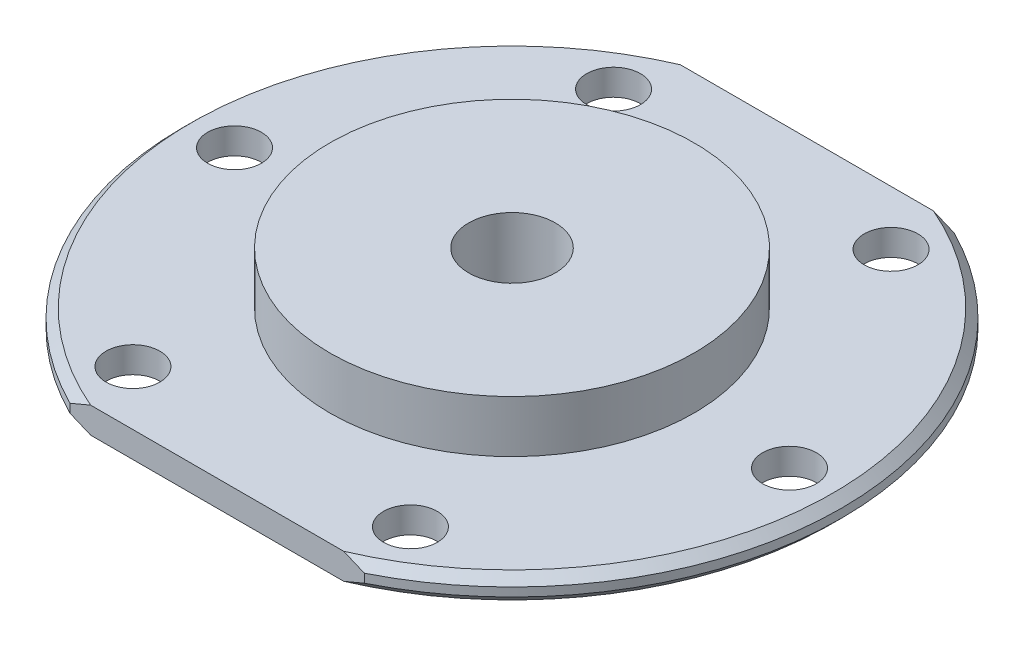
ISO-10303-21;
HEADER;
FILE_DESCRIPTION(('STEP AP214'),'2;1');
FILE_NAME('part.step','',(''),(''),'','','');
FILE_SCHEMA(('AUTOMOTIVE_DESIGN { 1 0 10303 214 1 1 1 1 }'));
ENDSEC;
DATA;
#1=APPLICATION_CONTEXT('core data for automotive mechanical design processes');
#2=APPLICATION_PROTOCOL_DEFINITION('international standard','automotive_design',2000,#1);
#3=PRODUCT_CONTEXT('',#1,'mechanical');
#4=PRODUCT('Part','Part','',(#3));
#5=PRODUCT_RELATED_PRODUCT_CATEGORY('part','',(#4));
#6=PRODUCT_DEFINITION_FORMATION('','',#4);
#7=PRODUCT_DEFINITION_CONTEXT('part definition',#1,'design');
#8=PRODUCT_DEFINITION('design','',#6,#7);
#9=PRODUCT_DEFINITION_SHAPE('','',#8);
#10=(LENGTH_UNIT() NAMED_UNIT(*) SI_UNIT(.MILLI.,.METRE.));
#11=(NAMED_UNIT(*) PLANE_ANGLE_UNIT() SI_UNIT($,.RADIAN.));
#12=(NAMED_UNIT(*) SI_UNIT($,.STERADIAN.) SOLID_ANGLE_UNIT());
#13=UNCERTAINTY_MEASURE_WITH_UNIT(LENGTH_MEASURE(1.E-05),#10,'distance_accuracy_value','');
#14=(GEOMETRIC_REPRESENTATION_CONTEXT(3) GLOBAL_UNCERTAINTY_ASSIGNED_CONTEXT((#13)) GLOBAL_UNIT_ASSIGNED_CONTEXT((#10,
#11,#12)) REPRESENTATION_CONTEXT('',''));
#15=CARTESIAN_POINT('',(0.,0.,0.));
#16=DIRECTION('',(0.,0.,1.));
#17=DIRECTION('',(1.,0.,0.));
#18=AXIS2_PLACEMENT_3D('',#15,#16,#17);
#19=CARTESIAN_POINT('',(0.,1.5,0.));
#20=DIRECTION('',(0.,1.,0.));
#21=DIRECTION('',(0.,0.,1.));
#22=AXIS2_PLACEMENT_3D('',#19,#20,#21);
#23=PLANE('',#22);
#24=CARTESIAN_POINT('',(0.,1.5,0.));
#25=DIRECTION('',(0.,1.,0.));
#26=DIRECTION('',(0.,0.,1.));
#27=AXIS2_PLACEMENT_3D('',#24,#25,#26);
#28=CIRCLE('',#27,10.5);
#29=CARTESIAN_POINT('',(0.,1.5,10.5));
#30=VERTEX_POINT('',#29);
#31=EDGE_CURVE('E124',#30,#30,#28,.T.);
#32=ORIENTED_EDGE('',*,*,#31,.F.);
#33=EDGE_LOOP('',(#32));
#34=FACE_BOUND('',#33,.T.);
#35=CARTESIAN_POINT('',(7.99999999999987,1.5,13.8564064605511));
#36=DIRECTION('',(0.,1.,0.));
#37=DIRECTION('',(0.,0.,1.));
#38=AXIS2_PLACEMENT_3D('',#35,#36,#37);
#39=CIRCLE('',#38,1.55);
#40=CARTESIAN_POINT('',(7.99999999999987,1.5,15.4064064605511));
#41=VERTEX_POINT('',#40);
#42=EDGE_CURVE('E332',#41,#41,#39,.T.);
#43=ORIENTED_EDGE('',*,*,#42,.F.);
#44=EDGE_LOOP('',(#43));
#45=FACE_BOUND('',#44,.T.);
#46=CARTESIAN_POINT('',(8.00000000000007,1.5,-13.856406460551));
#47=DIRECTION('',(0.,1.,0.));
#48=DIRECTION('',(0.,0.,1.));
#49=AXIS2_PLACEMENT_3D('',#46,#47,#48);
#50=CIRCLE('',#49,1.55);
#51=CARTESIAN_POINT('',(8.00000000000007,1.5,-12.306406460551));
#52=VERTEX_POINT('',#51);
#53=EDGE_CURVE('E344',#52,#52,#50,.T.);
#54=ORIENTED_EDGE('',*,*,#53,.F.);
#55=EDGE_LOOP('',(#54));
#56=FACE_BOUND('',#55,.T.);
#57=CARTESIAN_POINT('',(-16.,1.5,0.));
#58=DIRECTION('',(0.,1.,0.));
#59=DIRECTION('',(0.,0.,1.));
#60=AXIS2_PLACEMENT_3D('',#57,#58,#59);
#61=CIRCLE('',#60,1.55);
#62=CARTESIAN_POINT('',(-16.,1.5,1.55));
#63=VERTEX_POINT('',#62);
#64=EDGE_CURVE('E230',#63,#63,#61,.T.);
#65=ORIENTED_EDGE('',*,*,#64,.F.);
#66=EDGE_LOOP('',(#65));
#67=FACE_BOUND('',#66,.T.);
#68=DIRECTION('',(1.,0.,0.));
#69=VECTOR('',#68,1.);
#70=CARTESIAN_POINT('',(-8.48528137423857,1.5,17.));
#71=LINE('',#70,#69);
#72=CARTESIAN_POINT('',(-7.29725975966321,1.5,17.));
#73=VERTEX_POINT('',#72);
#74=CARTESIAN_POINT('',(7.2972597596632,1.5,17.));
#75=VERTEX_POINT('',#74);
#76=EDGE_CURVE('E361',#73,#75,#71,.T.);
#77=ORIENTED_EDGE('',*,*,#76,.T.);
#78=CARTESIAN_POINT('',(0.,1.5,0.));
#79=DIRECTION('',(0.,1.,0.));
#80=DIRECTION('',(0.,0.,1.));
#81=AXIS2_PLACEMENT_3D('',#78,#79,#80);
#82=CIRCLE('',#81,18.5);
#83=CARTESIAN_POINT('',(7.2972597596632,1.5,-17.));
#84=VERTEX_POINT('',#83);
#85=EDGE_CURVE('E235',#75,#84,#82,.T.);
#86=ORIENTED_EDGE('',*,*,#85,.T.);
#87=DIRECTION('',(-1.,0.,0.));
#88=VECTOR('',#87,1.);
#89=CARTESIAN_POINT('',(-8.48528137423856,1.5,-17.));
#90=LINE('',#89,#88);
#91=CARTESIAN_POINT('',(-7.2972597596632,1.5,-17.));
#92=VERTEX_POINT('',#91);
#93=EDGE_CURVE('E108',#84,#92,#90,.T.);
#94=ORIENTED_EDGE('',*,*,#93,.T.);
#95=CARTESIAN_POINT('',(0.,1.5,0.));
#96=DIRECTION('',(0.,1.,0.));
#97=DIRECTION('',(0.,0.,1.));
#98=AXIS2_PLACEMENT_3D('',#95,#96,#97);
#99=CIRCLE('',#98,18.5);
#100=EDGE_CURVE('E233',#92,#73,#99,.T.);
#101=ORIENTED_EDGE('',*,*,#100,.T.);
#102=EDGE_LOOP('',(#77,#86,#94,#101));
#103=FACE_BOUND('',#102,.T.);
#104=CARTESIAN_POINT('',(-7.99999999999997,1.5,-13.856406460551));
#105=DIRECTION('',(0.,1.,0.));
#106=DIRECTION('',(0.,0.,1.));
#107=AXIS2_PLACEMENT_3D('',#104,#105,#106);
#108=CIRCLE('',#107,1.55);
#109=CARTESIAN_POINT('',(-7.99999999999997,1.5,-12.306406460551));
#110=VERTEX_POINT('',#109);
#111=EDGE_CURVE('E350',#110,#110,#108,.T.);
#112=ORIENTED_EDGE('',*,*,#111,.F.);
#113=EDGE_LOOP('',(#112));
#114=FACE_BOUND('',#113,.T.);
#115=CARTESIAN_POINT('',(16.,1.5,1.1172740284298E-13));
#116=DIRECTION('',(0.,1.,0.));
#117=DIRECTION('',(0.,0.,1.));
#118=AXIS2_PLACEMENT_3D('',#115,#116,#117);
#119=CIRCLE('',#118,1.55);
#120=CARTESIAN_POINT('',(16.,1.5,1.55000000000011));
#121=VERTEX_POINT('',#120);
#122=EDGE_CURVE('E338',#121,#121,#119,.T.);
#123=ORIENTED_EDGE('',*,*,#122,.F.);
#124=EDGE_LOOP('',(#123));
#125=FACE_BOUND('',#124,.T.);
#126=CARTESIAN_POINT('',(-8.00000000000016,1.5,13.8564064605509));
#127=DIRECTION('',(0.,1.,0.));
#128=DIRECTION('',(0.,0.,1.));
#129=AXIS2_PLACEMENT_3D('',#126,#127,#128);
#130=CIRCLE('',#129,1.55);
#131=CARTESIAN_POINT('',(-8.00000000000016,1.5,15.4064064605509));
#132=VERTEX_POINT('',#131);
#133=EDGE_CURVE('E326',#132,#132,#130,.T.);
#134=ORIENTED_EDGE('',*,*,#133,.F.);
#135=EDGE_LOOP('',(#134));
#136=FACE_BOUND('',#135,.T.);
#137=ADVANCED_FACE('F35',(#34,#45,#56,#67,#103,#114,#125,#136),#23,.T.);
#138=CARTESIAN_POINT('',(0.,0.,0.));
#139=DIRECTION('',(0.,1.,0.));
#140=DIRECTION('',(0.,0.,1.));
#141=AXIS2_PLACEMENT_3D('',#138,#139,#140);
#142=PLANE('',#141);
#143=CARTESIAN_POINT('',(0.,0.,0.));
#144=DIRECTION('',(0.,-1.,0.));
#145=DIRECTION('',(0.,0.,-1.));
#146=AXIS2_PLACEMENT_3D('',#143,#144,#145);
#147=CIRCLE('',#146,5.);
#148=CARTESIAN_POINT('',(0.,0.,-5.));
#149=VERTEX_POINT('',#148);
#150=EDGE_CURVE('E320',#149,#149,#147,.T.);
#151=ORIENTED_EDGE('',*,*,#150,.F.);
#152=EDGE_LOOP('',(#151));
#153=FACE_BOUND('',#152,.T.);
#154=DIRECTION('',(-1.,0.,0.));
#155=VECTOR('',#154,1.);
#156=CARTESIAN_POINT('',(-8.48528137423856,0.,-17.));
#157=LINE('',#156,#155);
#158=CARTESIAN_POINT('',(7.29725975966319,0.,-17.));
#159=VERTEX_POINT('',#158);
#160=CARTESIAN_POINT('',(-7.29725975966319,0.,-17.));
#161=VERTEX_POINT('',#160);
#162=EDGE_CURVE('E223',#159,#161,#157,.T.);
#163=ORIENTED_EDGE('',*,*,#162,.F.);
#164=CARTESIAN_POINT('',(0.,0.,0.));
#165=DIRECTION('',(0.,1.,0.));
#166=DIRECTION('',(0.,0.,1.));
#167=AXIS2_PLACEMENT_3D('',#164,#165,#166);
#168=CIRCLE('',#167,18.5);
#169=CARTESIAN_POINT('',(7.29725975966319,0.,17.));
#170=VERTEX_POINT('',#169);
#171=EDGE_CURVE('E217',#159,#170,#168,.F.);
#172=ORIENTED_EDGE('',*,*,#171,.T.);
#173=DIRECTION('',(1.,0.,0.));
#174=VECTOR('',#173,1.);
#175=CARTESIAN_POINT('',(-8.48528137423857,0.,17.));
#176=LINE('',#175,#174);
#177=CARTESIAN_POINT('',(-7.29725975966321,0.,17.));
#178=VERTEX_POINT('',#177);
#179=EDGE_CURVE('E229',#178,#170,#176,.T.);
#180=ORIENTED_EDGE('',*,*,#179,.F.);
#181=CARTESIAN_POINT('',(0.,0.,0.));
#182=DIRECTION('',(0.,1.,0.));
#183=DIRECTION('',(0.,0.,1.));
#184=AXIS2_PLACEMENT_3D('',#181,#182,#183);
#185=CIRCLE('',#184,18.5);
#186=EDGE_CURVE('E218',#178,#161,#185,.F.);
#187=ORIENTED_EDGE('',*,*,#186,.T.);
#188=EDGE_LOOP('',(#163,#172,#180,#187));
#189=FACE_BOUND('',#188,.T.);
#190=CARTESIAN_POINT('',(-16.,0.,0.));
#191=DIRECTION('',(0.,1.,0.));
#192=DIRECTION('',(0.,0.,1.));
#193=AXIS2_PLACEMENT_3D('',#190,#191,#192);
#194=CIRCLE('',#193,1.55);
#195=CARTESIAN_POINT('',(-16.,0.,1.55));
#196=VERTEX_POINT('',#195);
#197=EDGE_CURVE('E353',#196,#196,#194,.T.);
#198=ORIENTED_EDGE('',*,*,#197,.T.);
#199=EDGE_LOOP('',(#198));
#200=FACE_BOUND('',#199,.T.);
#201=CARTESIAN_POINT('',(-7.99999999999997,0.,-13.856406460551));
#202=DIRECTION('',(0.,1.,0.));
#203=DIRECTION('',(0.,0.,1.));
#204=AXIS2_PLACEMENT_3D('',#201,#202,#203);
#205=CIRCLE('',#204,1.55);
#206=CARTESIAN_POINT('',(-7.99999999999997,0.,-12.306406460551));
#207=VERTEX_POINT('',#206);
#208=EDGE_CURVE('E347',#207,#207,#205,.T.);
#209=ORIENTED_EDGE('',*,*,#208,.T.);
#210=EDGE_LOOP('',(#209));
#211=FACE_BOUND('',#210,.T.);
#212=CARTESIAN_POINT('',(8.00000000000007,0.,-13.856406460551));
#213=DIRECTION('',(0.,1.,0.));
#214=DIRECTION('',(0.,0.,1.));
#215=AXIS2_PLACEMENT_3D('',#212,#213,#214);
#216=CIRCLE('',#215,1.55);
#217=CARTESIAN_POINT('',(8.00000000000007,0.,-12.306406460551));
#218=VERTEX_POINT('',#217);
#219=EDGE_CURVE('E341',#218,#218,#216,.T.);
#220=ORIENTED_EDGE('',*,*,#219,.T.);
#221=EDGE_LOOP('',(#220));
#222=FACE_BOUND('',#221,.T.);
#223=CARTESIAN_POINT('',(16.,0.,1.1172740284298E-13));
#224=DIRECTION('',(0.,1.,0.));
#225=DIRECTION('',(0.,0.,1.));
#226=AXIS2_PLACEMENT_3D('',#223,#224,#225);
#227=CIRCLE('',#226,1.55);
#228=CARTESIAN_POINT('',(16.,0.,1.55000000000011));
#229=VERTEX_POINT('',#228);
#230=EDGE_CURVE('E335',#229,#229,#227,.T.);
#231=ORIENTED_EDGE('',*,*,#230,.T.);
#232=EDGE_LOOP('',(#231));
#233=FACE_BOUND('',#232,.T.);
#234=CARTESIAN_POINT('',(7.99999999999987,0.,13.8564064605511));
#235=DIRECTION('',(0.,1.,0.));
#236=DIRECTION('',(0.,0.,1.));
#237=AXIS2_PLACEMENT_3D('',#234,#235,#236);
#238=CIRCLE('',#237,1.55);
#239=CARTESIAN_POINT('',(7.99999999999987,0.,15.4064064605511));
#240=VERTEX_POINT('',#239);
#241=EDGE_CURVE('E329',#240,#240,#238,.T.);
#242=ORIENTED_EDGE('',*,*,#241,.T.);
#243=EDGE_LOOP('',(#242));
#244=FACE_BOUND('',#243,.T.);
#245=CARTESIAN_POINT('',(-8.00000000000016,0.,13.8564064605509));
#246=DIRECTION('',(0.,1.,0.));
#247=DIRECTION('',(0.,0.,1.));
#248=AXIS2_PLACEMENT_3D('',#245,#246,#247);
#249=CIRCLE('',#248,1.55);
#250=CARTESIAN_POINT('',(-8.00000000000016,0.,15.4064064605509));
#251=VERTEX_POINT('',#250);
#252=EDGE_CURVE('E317',#251,#251,#249,.T.);
#253=ORIENTED_EDGE('',*,*,#252,.T.);
#254=EDGE_LOOP('',(#253));
#255=FACE_BOUND('',#254,.T.);
#256=ADVANCED_FACE('F207',(#153,#189,#200,#211,#222,#233,#244,#255),#142,.F.);
#257=CARTESIAN_POINT('',(0.,1.5,0.));
#258=DIRECTION('',(0.,-1.,0.));
#259=DIRECTION('',(0.,0.,-1.));
#260=AXIS2_PLACEMENT_3D('',#257,#258,#259);
#261=CYLINDRICAL_SURFACE('',#260,19.);
#262=DIRECTION('',(0.,-1.,0.));
#263=VECTOR('',#262,1.);
#264=CARTESIAN_POINT('',(8.48528137423857,1.5,17.));
#265=LINE('',#264,#263);
#266=CARTESIAN_POINT('',(8.48528137423857,1.,17.));
#267=VERTEX_POINT('',#266);
#268=CARTESIAN_POINT('',(8.48528137423857,0.5,17.));
#269=VERTEX_POINT('',#268);
#270=EDGE_CURVE('E362',#267,#269,#265,.T.);
#271=ORIENTED_EDGE('',*,*,#270,.T.);
#272=CARTESIAN_POINT('',(0.,0.5,0.));
#273=DIRECTION('',(0.,1.,0.));
#274=DIRECTION('',(0.,0.,1.));
#275=AXIS2_PLACEMENT_3D('',#272,#273,#274);
#276=CIRCLE('',#275,19.);
#277=CARTESIAN_POINT('',(8.48528137423856,0.5,-17.));
#278=VERTEX_POINT('',#277);
#279=EDGE_CURVE('E123',#269,#278,#276,.T.);
#280=ORIENTED_EDGE('',*,*,#279,.T.);
#281=DIRECTION('',(0.,-1.,0.));
#282=VECTOR('',#281,1.);
#283=CARTESIAN_POINT('',(8.48528137423856,1.5,-17.));
#284=LINE('',#283,#282);
#285=CARTESIAN_POINT('',(8.48528137423856,1.,-17.));
#286=VERTEX_POINT('',#285);
#287=EDGE_CURVE('E106',#286,#278,#284,.T.);
#288=ORIENTED_EDGE('',*,*,#287,.F.);
#289=CARTESIAN_POINT('',(0.,1.,0.));
#290=DIRECTION('',(0.,1.,0.));
#291=DIRECTION('',(0.,0.,1.));
#292=AXIS2_PLACEMENT_3D('',#289,#290,#291);
#293=CIRCLE('',#292,19.);
#294=EDGE_CURVE('E120',#286,#267,#293,.F.);
#295=ORIENTED_EDGE('',*,*,#294,.T.);
#296=EDGE_LOOP('',(#271,#280,#288,#295));
#297=FACE_BOUND('',#296,.T.);
#298=ADVANCED_FACE('F119',(#297),#261,.T.);
#299=CARTESIAN_POINT('',(-8.48528137423856,1.5,-17.));
#300=DIRECTION('',(0.,0.,1.));
#301=DIRECTION('',(1.,0.,0.));
#302=AXIS2_PLACEMENT_3D('',#299,#300,#301);
#303=PLANE('',#302);
#304=ORIENTED_EDGE('',*,*,#287,.T.);
#305=CARTESIAN_POINT('',(8.48528137423856,0.5,-17.));
#306=CARTESIAN_POINT('',(8.38719130902524,0.456193751763006,-17.));
#307=CARTESIAN_POINT('',(8.28887455002268,0.412894043845016,-17.));
#308=CARTESIAN_POINT('',(8.0917954990056,0.327354382119743,-17.));
#309=CARTESIAN_POINT('',(7.99303326311036,0.285114298994633,-17.));
#310=CARTESIAN_POINT('',(7.79504652511085,0.201729571878801,-17.));
#311=CARTESIAN_POINT('',(7.69582202053382,0.160584933755774,-17.));
#312=CARTESIAN_POINT('',(7.49689622621428,0.0794296704768765,-17.));
#313=CARTESIAN_POINT('',(7.3971948794835,0.039419185034765,-17.));
#314=CARTESIAN_POINT('',(7.2972597596632,0.,-17.));
#315=B_SPLINE_CURVE_WITH_KNOTS('',3,(#305,#306,#307,#308,#309,#310,#311,#312,#313,#314),
.UNSPECIFIED.,.F.,.F.,(4,2,2,2,4),(0.,0.322281422409653,0.644523319969033,0.966766943253074,
1.28905009200689),.UNSPECIFIED.);
#316=EDGE_CURVE('E113',#278,#159,#315,.T.);
#317=ORIENTED_EDGE('',*,*,#316,.T.);
#318=ORIENTED_EDGE('',*,*,#162,.T.);
#319=CARTESIAN_POINT('',(-7.29725975966319,0.,-17.));
#320=CARTESIAN_POINT('',(-7.39719487948349,0.0394191850347754,-17.));
#321=CARTESIAN_POINT('',(-7.49689622621428,0.0794296704768808,-17.));
#322=CARTESIAN_POINT('',(-7.69582202053382,0.160584933755773,-17.));
#323=CARTESIAN_POINT('',(-7.79504652511085,0.201729571878801,-17.));
#324=CARTESIAN_POINT('',(-7.99303326311035,0.285114298994633,-17.));
#325=CARTESIAN_POINT('',(-8.0917954990056,0.327354382119744,-17.));
#326=CARTESIAN_POINT('',(-8.28887455002268,0.412894043845014,-17.));
#327=CARTESIAN_POINT('',(-8.38719130902524,0.456193751763,-17.));
#328=CARTESIAN_POINT('',(-8.48528137423856,0.499999999999986,-17.));
#329=B_SPLINE_CURVE_WITH_KNOTS('',3,(#319,#320,#321,#322,#323,#324,#325,#326,#327,#328),
.UNSPECIFIED.,.F.,.F.,(4,2,2,2,4),(0.,0.322283148753815,0.644526772037856,0.966768669597235,
1.28905009200689),.UNSPECIFIED.);
#330=CARTESIAN_POINT('',(-8.48528137423856,0.5,-17.));
#331=VERTEX_POINT('',#330);
#332=EDGE_CURVE('E114',#161,#331,#329,.T.);
#333=ORIENTED_EDGE('',*,*,#332,.T.);
#334=DIRECTION('',(0.,-1.,0.));
#335=VECTOR('',#334,1.);
#336=CARTESIAN_POINT('',(-8.48528137423856,1.5,-17.));
#337=LINE('',#336,#335);
#338=CARTESIAN_POINT('',(-8.48528137423856,1.,-17.));
#339=VERTEX_POINT('',#338);
#340=EDGE_CURVE('E125',#339,#331,#337,.T.);
#341=ORIENTED_EDGE('',*,*,#340,.F.);
#342=CARTESIAN_POINT('',(-8.48528137423856,1.,-17.));
#343=CARTESIAN_POINT('',(-8.38719130902524,1.043806248237,-17.));
#344=CARTESIAN_POINT('',(-8.28887455002269,1.08710595615498,-17.));
#345=CARTESIAN_POINT('',(-8.0917954990056,1.17264561788026,-17.));
#346=CARTESIAN_POINT('',(-7.99303326311036,1.21488570100537,-17.));
#347=CARTESIAN_POINT('',(-7.79504652511086,1.2982704281212,-17.));
#348=CARTESIAN_POINT('',(-7.69582202053382,1.33941506624422,-17.));
#349=CARTESIAN_POINT('',(-7.49689622621428,1.42057032952312,-17.));
#350=CARTESIAN_POINT('',(-7.39719487948351,1.46058081496524,-17.));
#351=CARTESIAN_POINT('',(-7.29725975966321,1.50000000000003,-17.));
#352=B_SPLINE_CURVE_WITH_KNOTS('',3,(#342,#343,#344,#345,#346,#347,#348,#349,#350,#351),
.UNSPECIFIED.,.F.,.F.,(4,2,2,2,4),(0.,0.32228142240965,0.644523319969028,0.966766943253069,
1.28905009200688),.UNSPECIFIED.);
#353=EDGE_CURVE('E132',#339,#92,#352,.T.);
#354=ORIENTED_EDGE('',*,*,#353,.T.);
#355=ORIENTED_EDGE('',*,*,#93,.F.);
#356=CARTESIAN_POINT('',(7.2972597596632,1.5,-17.));
#357=CARTESIAN_POINT('',(7.3971948794835,1.46058081496522,-17.));
#358=CARTESIAN_POINT('',(7.49689622621428,1.42057032952312,-17.));
#359=CARTESIAN_POINT('',(7.69582202053382,1.33941506624423,-17.));
#360=CARTESIAN_POINT('',(7.79504652511086,1.2982704281212,-17.));
#361=CARTESIAN_POINT('',(7.99303326311036,1.21488570100537,-17.));
#362=CARTESIAN_POINT('',(8.0917954990056,1.17264561788026,-17.));
#363=CARTESIAN_POINT('',(8.28887455002268,1.08710595615498,-17.));
#364=CARTESIAN_POINT('',(8.38719130902524,1.043806248237,-17.));
#365=CARTESIAN_POINT('',(8.48528137423856,1.00000000000001,-17.));
#366=B_SPLINE_CURVE_WITH_KNOTS('',3,(#356,#357,#358,#359,#360,#361,#362,#363,#364,#365),
.UNSPECIFIED.,.F.,.F.,(4,2,2,2,4),(0.,0.322283148753814,0.644526772037853,0.966768669597231,
1.28905009200688),.UNSPECIFIED.);
#367=EDGE_CURVE('E103',#84,#286,#366,.T.);
#368=ORIENTED_EDGE('',*,*,#367,.T.);
#369=EDGE_LOOP('',(#304,#317,#318,#333,#341,#354,#355,#368));
#370=FACE_BOUND('',#369,.T.);
#371=ADVANCED_FACE('F105',(#370),#303,.F.);
#372=CARTESIAN_POINT('',(0.,1.5,0.));
#373=DIRECTION('',(0.,-1.,0.));
#374=DIRECTION('',(0.,0.,-1.));
#375=AXIS2_PLACEMENT_3D('',#372,#373,#374);
#376=CYLINDRICAL_SURFACE('',#375,19.);
#377=ORIENTED_EDGE('',*,*,#340,.T.);
#378=CARTESIAN_POINT('',(0.,0.5,0.));
#379=DIRECTION('',(0.,1.,0.));
#380=DIRECTION('',(0.,0.,1.));
#381=AXIS2_PLACEMENT_3D('',#378,#379,#380);
#382=CIRCLE('',#381,19.);
#383=CARTESIAN_POINT('',(-8.48528137423857,0.5,17.));
#384=VERTEX_POINT('',#383);
#385=EDGE_CURVE('E11',#331,#384,#382,.T.);
#386=ORIENTED_EDGE('',*,*,#385,.T.);
#387=DIRECTION('',(0.,-1.,0.));
#388=VECTOR('',#387,1.);
#389=CARTESIAN_POINT('',(-8.48528137423857,1.5,17.));
#390=LINE('',#389,#388);
#391=CARTESIAN_POINT('',(-8.48528137423857,1.,17.));
#392=VERTEX_POINT('',#391);
#393=EDGE_CURVE('E244',#392,#384,#390,.T.);
#394=ORIENTED_EDGE('',*,*,#393,.F.);
#395=CARTESIAN_POINT('',(0.,1.,0.));
#396=DIRECTION('',(0.,1.,0.));
#397=DIRECTION('',(0.,0.,1.));
#398=AXIS2_PLACEMENT_3D('',#395,#396,#397);
#399=CIRCLE('',#398,19.);
#400=EDGE_CURVE('E45',#392,#339,#399,.F.);
#401=ORIENTED_EDGE('',*,*,#400,.T.);
#402=EDGE_LOOP('',(#377,#386,#394,#401));
#403=FACE_BOUND('',#402,.T.);
#404=ADVANCED_FACE('F153',(#403),#376,.T.);
#405=CARTESIAN_POINT('',(-8.48528137423857,1.5,17.));
#406=DIRECTION('',(0.,0.,-1.));
#407=DIRECTION('',(-1.,0.,0.));
#408=AXIS2_PLACEMENT_3D('',#405,#406,#407);
#409=PLANE('',#408);
#410=ORIENTED_EDGE('',*,*,#179,.T.);
#411=CARTESIAN_POINT('',(7.29725975966319,0.,17.));
#412=CARTESIAN_POINT('',(7.3971948794835,0.0394191850347752,17.));
#413=CARTESIAN_POINT('',(7.49689622621428,0.0794296704768804,17.));
#414=CARTESIAN_POINT('',(7.69582202053382,0.160584933755772,17.));
#415=CARTESIAN_POINT('',(7.79504652511086,0.2017295718788,17.));
#416=CARTESIAN_POINT('',(7.99303326311036,0.285114298994634,17.));
#417=CARTESIAN_POINT('',(8.0917954990056,0.327354382119746,17.));
#418=CARTESIAN_POINT('',(8.28887455002269,0.412894043845018,17.));
#419=CARTESIAN_POINT('',(8.38719130902525,0.456193751763004,17.));
#420=CARTESIAN_POINT('',(8.48528137423857,0.49999999999999,17.));
#421=B_SPLINE_CURVE_WITH_KNOTS('',3,(#411,#412,#413,#414,#415,#416,#417,#418,#419,#420),
.UNSPECIFIED.,.F.,.F.,(4,2,2,2,4),(0.,0.322283148753818,0.64452677203786,0.966768669597242,
1.2890500920069),.UNSPECIFIED.);
#422=EDGE_CURVE('E191',#170,#269,#421,.T.);
#423=ORIENTED_EDGE('',*,*,#422,.T.);
#424=ORIENTED_EDGE('',*,*,#270,.F.);
#425=CARTESIAN_POINT('',(8.48528137423857,1.,17.));
#426=CARTESIAN_POINT('',(8.38719130902525,1.04380624823699,17.));
#427=CARTESIAN_POINT('',(8.28887455002269,1.08710595615498,17.));
#428=CARTESIAN_POINT('',(8.09179549900561,1.17264561788025,17.));
#429=CARTESIAN_POINT('',(7.99303326311036,1.21488570100537,17.));
#430=CARTESIAN_POINT('',(7.79504652511086,1.2982704281212,17.));
#431=CARTESIAN_POINT('',(7.69582202053382,1.33941506624423,17.));
#432=CARTESIAN_POINT('',(7.49689622621429,1.42057032952312,17.));
#433=CARTESIAN_POINT('',(7.39719487948351,1.46058081496524,17.));
#434=CARTESIAN_POINT('',(7.29725975966321,1.50000000000002,17.));
#435=B_SPLINE_CURVE_WITH_KNOTS('',3,(#425,#426,#427,#428,#429,#430,#431,#432,#433,#434),
.UNSPECIFIED.,.F.,.F.,(4,2,2,2,4),(0.,0.322281422409653,0.644523319969034,0.966766943253075,
1.28905009200689),.UNSPECIFIED.);
#436=EDGE_CURVE('E129',#267,#75,#435,.T.);
#437=ORIENTED_EDGE('',*,*,#436,.T.);
#438=ORIENTED_EDGE('',*,*,#76,.F.);
#439=CARTESIAN_POINT('',(-7.29725975966321,1.5,17.));
#440=CARTESIAN_POINT('',(-7.39719487948352,1.46058081496523,17.));
#441=CARTESIAN_POINT('',(-7.4968962262143,1.42057032952312,17.));
#442=CARTESIAN_POINT('',(-7.69582202053383,1.33941506624423,17.));
#443=CARTESIAN_POINT('',(-7.79504652511087,1.2982704281212,17.));
#444=CARTESIAN_POINT('',(-7.99303326311037,1.21488570100536,17.));
#445=CARTESIAN_POINT('',(-8.09179549900561,1.17264561788025,17.));
#446=CARTESIAN_POINT('',(-8.2888745500227,1.08710595615498,17.));
#447=CARTESIAN_POINT('',(-8.38719130902526,1.043806248237,17.));
#448=CARTESIAN_POINT('',(-8.48528137423858,1.00000000000001,17.));
#449=B_SPLINE_CURVE_WITH_KNOTS('',3,(#439,#440,#441,#442,#443,#444,#445,#446,#447,#448),
.UNSPECIFIED.,.F.,.F.,(4,2,2,2,4),(0.,0.322283148753813,0.644526772037853,0.966768669597232,
1.28905009200688),.UNSPECIFIED.);
#450=EDGE_CURVE('E59',#73,#392,#449,.T.);
#451=ORIENTED_EDGE('',*,*,#450,.T.);
#452=ORIENTED_EDGE('',*,*,#393,.T.);
#453=CARTESIAN_POINT('',(-8.48528137423857,0.5,17.));
#454=CARTESIAN_POINT('',(-8.38719130902525,0.456193751763006,17.));
#455=CARTESIAN_POINT('',(-8.2888745500227,0.412894043845016,17.));
#456=CARTESIAN_POINT('',(-8.09179549900561,0.327354382119744,17.));
#457=CARTESIAN_POINT('',(-7.99303326311037,0.285114298994633,17.));
#458=CARTESIAN_POINT('',(-7.79504652511087,0.201729571878801,17.));
#459=CARTESIAN_POINT('',(-7.69582202053383,0.160584933755774,17.));
#460=CARTESIAN_POINT('',(-7.49689622621429,0.0794296704768769,17.));
#461=CARTESIAN_POINT('',(-7.39719487948352,0.0394191850347653,17.));
#462=CARTESIAN_POINT('',(-7.29725975966322,0.,17.));
#463=B_SPLINE_CURVE_WITH_KNOTS('',3,(#453,#454,#455,#456,#457,#458,#459,#460,#461,#462),
.UNSPECIFIED.,.F.,.F.,(4,2,2,2,4),(0.,0.322281422409653,0.644523319969033,0.966766943253073,
1.28905009200689),.UNSPECIFIED.);
#464=EDGE_CURVE('E52',#384,#178,#463,.T.);
#465=ORIENTED_EDGE('',*,*,#464,.T.);
#466=EDGE_LOOP('',(#410,#423,#424,#437,#438,#451,#452,#465));
#467=FACE_BOUND('',#466,.T.);
#468=ADVANCED_FACE('F202',(#467),#409,.F.);
#469=CARTESIAN_POINT('',(-16.,1.5,0.));
#470=DIRECTION('',(0.,-1.,0.));
#471=DIRECTION('',(0.,0.,-1.));
#472=AXIS2_PLACEMENT_3D('',#469,#470,#471);
#473=CYLINDRICAL_SURFACE('',#472,1.55);
#474=ORIENTED_EDGE('',*,*,#64,.T.);
#475=EDGE_LOOP('',(#474));
#476=FACE_BOUND('',#475,.T.);
#477=ORIENTED_EDGE('',*,*,#197,.F.);
#478=EDGE_LOOP('',(#477));
#479=FACE_BOUND('',#478,.T.);
#480=ADVANCED_FACE('F206',(#476,#479),#473,.F.);
#481=CARTESIAN_POINT('',(-7.99999999999997,1.5,-13.856406460551));
#482=DIRECTION('',(0.,-1.,0.));
#483=DIRECTION('',(0.,0.,-1.));
#484=AXIS2_PLACEMENT_3D('',#481,#482,#483);
#485=CYLINDRICAL_SURFACE('',#484,1.55);
#486=ORIENTED_EDGE('',*,*,#111,.T.);
#487=EDGE_LOOP('',(#486));
#488=FACE_BOUND('',#487,.T.);
#489=ORIENTED_EDGE('',*,*,#208,.F.);
#490=EDGE_LOOP('',(#489));
#491=FACE_BOUND('',#490,.T.);
#492=ADVANCED_FACE('F263',(#488,#491),#485,.F.);
#493=CARTESIAN_POINT('',(8.00000000000007,1.5,-13.856406460551));
#494=DIRECTION('',(0.,-1.,0.));
#495=DIRECTION('',(0.,0.,-1.));
#496=AXIS2_PLACEMENT_3D('',#493,#494,#495);
#497=CYLINDRICAL_SURFACE('',#496,1.55);
#498=ORIENTED_EDGE('',*,*,#53,.T.);
#499=EDGE_LOOP('',(#498));
#500=FACE_BOUND('',#499,.T.);
#501=ORIENTED_EDGE('',*,*,#219,.F.);
#502=EDGE_LOOP('',(#501));
#503=FACE_BOUND('',#502,.T.);
#504=ADVANCED_FACE('F267',(#500,#503),#497,.F.);
#505=CARTESIAN_POINT('',(16.,1.5,1.1172740284298E-13));
#506=DIRECTION('',(0.,-1.,0.));
#507=DIRECTION('',(0.,0.,-1.));
#508=AXIS2_PLACEMENT_3D('',#505,#506,#507);
#509=CYLINDRICAL_SURFACE('',#508,1.55);
#510=ORIENTED_EDGE('',*,*,#122,.T.);
#511=EDGE_LOOP('',(#510));
#512=FACE_BOUND('',#511,.T.);
#513=ORIENTED_EDGE('',*,*,#230,.F.);
#514=EDGE_LOOP('',(#513));
#515=FACE_BOUND('',#514,.T.);
#516=ADVANCED_FACE('F271',(#512,#515),#509,.F.);
#517=CARTESIAN_POINT('',(7.99999999999987,1.5,13.8564064605511));
#518=DIRECTION('',(0.,-1.,0.));
#519=DIRECTION('',(0.,0.,-1.));
#520=AXIS2_PLACEMENT_3D('',#517,#518,#519);
#521=CYLINDRICAL_SURFACE('',#520,1.55);
#522=ORIENTED_EDGE('',*,*,#42,.T.);
#523=EDGE_LOOP('',(#522));
#524=FACE_BOUND('',#523,.T.);
#525=ORIENTED_EDGE('',*,*,#241,.F.);
#526=EDGE_LOOP('',(#525));
#527=FACE_BOUND('',#526,.T.);
#528=ADVANCED_FACE('F275',(#524,#527),#521,.F.);
#529=CARTESIAN_POINT('',(-8.00000000000016,1.5,13.8564064605509));
#530=DIRECTION('',(0.,-1.,0.));
#531=DIRECTION('',(0.,0.,-1.));
#532=AXIS2_PLACEMENT_3D('',#529,#530,#531);
#533=CYLINDRICAL_SURFACE('',#532,1.55);
#534=ORIENTED_EDGE('',*,*,#133,.T.);
#535=EDGE_LOOP('',(#534));
#536=FACE_BOUND('',#535,.T.);
#537=ORIENTED_EDGE('',*,*,#252,.F.);
#538=EDGE_LOOP('',(#537));
#539=FACE_BOUND('',#538,.T.);
#540=ADVANCED_FACE('F279',(#536,#539),#533,.F.);
#541=CARTESIAN_POINT('',(0.,4.5,0.));
#542=DIRECTION('',(0.,-1.,0.));
#543=DIRECTION('',(0.,0.,-1.));
#544=AXIS2_PLACEMENT_3D('',#541,#542,#543);
#545=CYLINDRICAL_SURFACE('',#544,10.5);
#546=CARTESIAN_POINT('',(0.,4.5,0.));
#547=DIRECTION('',(0.,1.,0.));
#548=DIRECTION('',(0.,0.,1.));
#549=AXIS2_PLACEMENT_3D('',#546,#547,#548);
#550=CIRCLE('',#549,10.5);
#551=CARTESIAN_POINT('',(0.,4.5,10.5));
#552=VERTEX_POINT('',#551);
#553=EDGE_CURVE('E314',#552,#552,#550,.T.);
#554=ORIENTED_EDGE('',*,*,#553,.F.);
#555=EDGE_LOOP('',(#554));
#556=FACE_BOUND('',#555,.T.);
#557=ORIENTED_EDGE('',*,*,#31,.T.);
#558=EDGE_LOOP('',(#557));
#559=FACE_BOUND('',#558,.T.);
#560=ADVANCED_FACE('F283',(#556,#559),#545,.T.);
#561=CARTESIAN_POINT('',(0.,4.5,0.));
#562=DIRECTION('',(0.,1.,0.));
#563=DIRECTION('',(0.,0.,1.));
#564=AXIS2_PLACEMENT_3D('',#561,#562,#563);
#565=PLANE('',#564);
#566=CARTESIAN_POINT('',(0.,4.5,0.));
#567=DIRECTION('',(0.,1.,0.));
#568=DIRECTION('',(0.,0.,1.));
#569=AXIS2_PLACEMENT_3D('',#566,#567,#568);
#570=CIRCLE('',#569,2.5);
#571=CARTESIAN_POINT('',(0.,4.5,2.5));
#572=VERTEX_POINT('',#571);
#573=EDGE_CURVE('E313',#572,#572,#570,.T.);
#574=ORIENTED_EDGE('',*,*,#573,.F.);
#575=EDGE_LOOP('',(#574));
#576=FACE_BOUND('',#575,.T.);
#577=ORIENTED_EDGE('',*,*,#553,.T.);
#578=EDGE_LOOP('',(#577));
#579=FACE_BOUND('',#578,.T.);
#580=ADVANCED_FACE('F287',(#576,#579),#565,.T.);
#581=CARTESIAN_POINT('',(0.,-5.,0.));
#582=DIRECTION('',(0.,1.,0.));
#583=DIRECTION('',(0.,0.,1.));
#584=AXIS2_PLACEMENT_3D('',#581,#582,#583);
#585=CYLINDRICAL_SURFACE('',#584,5.);
#586=CARTESIAN_POINT('',(0.,-4.5,0.));
#587=DIRECTION('',(0.,-1.,0.));
#588=DIRECTION('',(0.,0.,-1.));
#589=AXIS2_PLACEMENT_3D('',#586,#587,#588);
#590=CIRCLE('',#589,5.);
#591=CARTESIAN_POINT('',(0.,-4.5,-5.));
#592=VERTEX_POINT('',#591);
#593=EDGE_CURVE('E135',#592,#592,#590,.F.);
#594=ORIENTED_EDGE('',*,*,#593,.T.);
#595=EDGE_LOOP('',(#594));
#596=FACE_BOUND('',#595,.T.);
#597=ORIENTED_EDGE('',*,*,#150,.T.);
#598=EDGE_LOOP('',(#597));
#599=FACE_BOUND('',#598,.T.);
#600=ADVANCED_FACE('F291',(#596,#599),#585,.T.);
#601=CARTESIAN_POINT('',(0.,-5.,0.));
#602=DIRECTION('',(0.,-1.,0.));
#603=DIRECTION('',(0.,0.,-1.));
#604=AXIS2_PLACEMENT_3D('',#601,#602,#603);
#605=PLANE('',#604);
#606=CARTESIAN_POINT('',(0.,-5.,0.));
#607=DIRECTION('',(0.,-1.,0.));
#608=DIRECTION('',(0.,0.,-1.));
#609=AXIS2_PLACEMENT_3D('',#606,#607,#608);
#610=CIRCLE('',#609,4.5);
#611=CARTESIAN_POINT('',(0.,-5.,-4.5));
#612=VERTEX_POINT('',#611);
#613=EDGE_CURVE('E369',#612,#612,#610,.T.);
#614=ORIENTED_EDGE('',*,*,#613,.T.);
#615=EDGE_LOOP('',(#614));
#616=FACE_BOUND('',#615,.T.);
#617=CARTESIAN_POINT('',(0.,-5.,0.));
#618=DIRECTION('',(0.,-1.,0.));
#619=DIRECTION('',(0.,0.,-1.));
#620=AXIS2_PLACEMENT_3D('',#617,#618,#619);
#621=CIRCLE('',#620,2.99999999999999);
#622=CARTESIAN_POINT('',(0.,-5.,-2.99999999999999));
#623=VERTEX_POINT('',#622);
#624=EDGE_CURVE('E322',#623,#623,#621,.F.);
#625=ORIENTED_EDGE('',*,*,#624,.T.);
#626=EDGE_LOOP('',(#625));
#627=FACE_BOUND('',#626,.T.);
#628=ADVANCED_FACE('F295',(#616,#627),#605,.T.);
#629=CARTESIAN_POINT('',(0.,-5.,0.));
#630=DIRECTION('',(0.,1.,0.));
#631=DIRECTION('',(0.,0.,1.));
#632=AXIS2_PLACEMENT_3D('',#629,#630,#631);
#633=CYLINDRICAL_SURFACE('',#632,2.5);
#634=CARTESIAN_POINT('',(0.,-4.50000000000001,0.));
#635=DIRECTION('',(0.,-1.,0.));
#636=DIRECTION('',(0.,0.,-1.));
#637=AXIS2_PLACEMENT_3D('',#634,#635,#636);
#638=CIRCLE('',#637,2.5);
#639=CARTESIAN_POINT('',(0.,-4.50000000000001,-2.5));
#640=VERTEX_POINT('',#639);
#641=EDGE_CURVE('E130',#640,#640,#638,.T.);
#642=ORIENTED_EDGE('',*,*,#641,.T.);
#643=EDGE_LOOP('',(#642));
#644=FACE_BOUND('',#643,.T.);
#645=ORIENTED_EDGE('',*,*,#573,.T.);
#646=EDGE_LOOP('',(#645));
#647=FACE_BOUND('',#646,.T.);
#648=ADVANCED_FACE('F299',(#644,#647),#633,.F.);
#649=CARTESIAN_POINT('',(0.,-5.,0.));
#650=DIRECTION('',(0.,1.,0.));
#651=DIRECTION('',(0.,0.,1.));
#652=AXIS2_PLACEMENT_3D('',#649,#650,#651);
#653=CONICAL_SURFACE('',#652,4.5,0.785398163397445);
#654=ORIENTED_EDGE('',*,*,#593,.F.);
#655=EDGE_LOOP('',(#654));
#656=FACE_BOUND('',#655,.T.);
#657=ORIENTED_EDGE('',*,*,#613,.F.);
#658=EDGE_LOOP('',(#657));
#659=FACE_BOUND('',#658,.T.);
#660=ADVANCED_FACE('F302',(#656,#659),#653,.T.);
#661=CARTESIAN_POINT('',(0.,-5.,0.));
#662=DIRECTION('',(0.,-1.,0.));
#663=DIRECTION('',(0.,0.,-1.));
#664=AXIS2_PLACEMENT_3D('',#661,#662,#663);
#665=CONICAL_SURFACE('',#664,2.99999999999999,0.785398163397444);
#666=ORIENTED_EDGE('',*,*,#641,.F.);
#667=EDGE_LOOP('',(#666));
#668=FACE_BOUND('',#667,.T.);
#669=ORIENTED_EDGE('',*,*,#624,.F.);
#670=EDGE_LOOP('',(#669));
#671=FACE_BOUND('',#670,.T.);
#672=ADVANCED_FACE('F307',(#668,#671),#665,.F.);
#673=CARTESIAN_POINT('',(0.,0.5,0.));
#674=DIRECTION('',(0.,1.,0.));
#675=DIRECTION('',(0.,0.,1.));
#676=AXIS2_PLACEMENT_3D('',#673,#674,#675);
#677=CONICAL_SURFACE('',#676,19.,0.785398163397452);
#678=ORIENTED_EDGE('',*,*,#422,.F.);
#679=ORIENTED_EDGE('',*,*,#171,.F.);
#680=ORIENTED_EDGE('',*,*,#316,.F.);
#681=ORIENTED_EDGE('',*,*,#279,.F.);
#682=EDGE_LOOP('',(#678,#679,#680,#681));
#683=FACE_BOUND('',#682,.T.);
#684=ADVANCED_FACE('F179',(#683),#677,.T.);
#685=CARTESIAN_POINT('',(0.,1.5,0.));
#686=DIRECTION('',(0.,-1.,0.));
#687=DIRECTION('',(0.,0.,-1.));
#688=AXIS2_PLACEMENT_3D('',#685,#686,#687);
#689=CONICAL_SURFACE('',#688,18.5,0.785398163397448);
#690=ORIENTED_EDGE('',*,*,#436,.F.);
#691=ORIENTED_EDGE('',*,*,#294,.F.);
#692=ORIENTED_EDGE('',*,*,#367,.F.);
#693=ORIENTED_EDGE('',*,*,#85,.F.);
#694=EDGE_LOOP('',(#690,#691,#692,#693));
#695=FACE_BOUND('',#694,.T.);
#696=ADVANCED_FACE('F128',(#695),#689,.T.);
#697=CARTESIAN_POINT('',(0.,0.5,0.));
#698=DIRECTION('',(0.,1.,0.));
#699=DIRECTION('',(0.,0.,1.));
#700=AXIS2_PLACEMENT_3D('',#697,#698,#699);
#701=CONICAL_SURFACE('',#700,19.,0.785398163397452);
#702=ORIENTED_EDGE('',*,*,#332,.F.);
#703=ORIENTED_EDGE('',*,*,#186,.F.);
#704=ORIENTED_EDGE('',*,*,#464,.F.);
#705=ORIENTED_EDGE('',*,*,#385,.F.);
#706=EDGE_LOOP('',(#702,#703,#704,#705));
#707=FACE_BOUND('',#706,.T.);
#708=ADVANCED_FACE('F178',(#707),#701,.T.);
#709=CARTESIAN_POINT('',(0.,1.5,0.));
#710=DIRECTION('',(0.,-1.,0.));
#711=DIRECTION('',(0.,0.,-1.));
#712=AXIS2_PLACEMENT_3D('',#709,#710,#711);
#713=CONICAL_SURFACE('',#712,18.5,0.785398163397448);
#714=ORIENTED_EDGE('',*,*,#353,.F.);
#715=ORIENTED_EDGE('',*,*,#400,.F.);
#716=ORIENTED_EDGE('',*,*,#450,.F.);
#717=ORIENTED_EDGE('',*,*,#100,.F.);
#718=EDGE_LOOP('',(#714,#715,#716,#717));
#719=FACE_BOUND('',#718,.T.);
#720=ADVANCED_FACE('F38',(#719),#713,.T.);
#721=CLOSED_SHELL('',(#137,#256,#298,#371,#404,#468,#480,#492,#504,#516,#528,#540,#560,#580,
#600,#628,#648,#660,#672,#684,#696,#708,#720));
#722=MANIFOLD_SOLID_BREP('B2',#721);
#723=ADVANCED_BREP_SHAPE_REPRESENTATION('',(#18,#722),#14);
#724=SHAPE_DEFINITION_REPRESENTATION(#9,#723);
ENDSEC;
END-ISO-10303-21;
